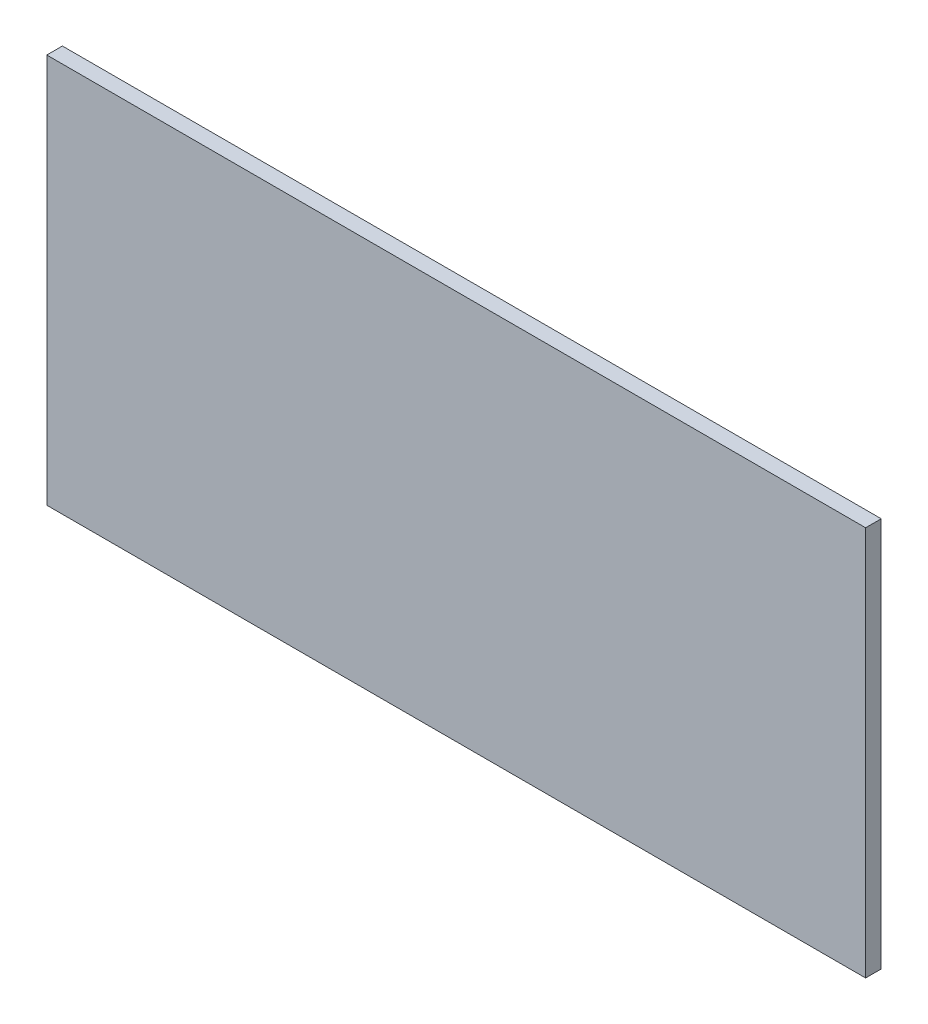
ISO-10303-21;
HEADER;
FILE_DESCRIPTION(('STEP AP214'),'2;1');
FILE_NAME('part.step','',(''),(''),'','','');
FILE_SCHEMA(('AUTOMOTIVE_DESIGN { 1 0 10303 214 1 1 1 1 }'));
ENDSEC;
DATA;
#1=APPLICATION_CONTEXT('core data for automotive mechanical design processes');
#2=APPLICATION_PROTOCOL_DEFINITION('international standard','automotive_design',2000,#1);
#3=PRODUCT_CONTEXT('',#1,'mechanical');
#4=PRODUCT('Part','Part','',(#3));
#5=PRODUCT_RELATED_PRODUCT_CATEGORY('part','',(#4));
#6=PRODUCT_DEFINITION_FORMATION('','',#4);
#7=PRODUCT_DEFINITION_CONTEXT('part definition',#1,'design');
#8=PRODUCT_DEFINITION('design','',#6,#7);
#9=PRODUCT_DEFINITION_SHAPE('','',#8);
#10=(LENGTH_UNIT() NAMED_UNIT(*) SI_UNIT(.MILLI.,.METRE.));
#11=(NAMED_UNIT(*) PLANE_ANGLE_UNIT() SI_UNIT($,.RADIAN.));
#12=(NAMED_UNIT(*) SI_UNIT($,.STERADIAN.) SOLID_ANGLE_UNIT());
#13=UNCERTAINTY_MEASURE_WITH_UNIT(LENGTH_MEASURE(1.E-05),#10,'distance_accuracy_value','');
#14=(GEOMETRIC_REPRESENTATION_CONTEXT(3) GLOBAL_UNCERTAINTY_ASSIGNED_CONTEXT((#13)) GLOBAL_UNIT_ASSIGNED_CONTEXT((#10,
#11,#12)) REPRESENTATION_CONTEXT('',''));
#15=CARTESIAN_POINT('',(0.,0.,0.));
#16=DIRECTION('',(0.,0.,1.));
#17=DIRECTION('',(1.,0.,0.));
#18=AXIS2_PLACEMENT_3D('',#15,#16,#17);
#19=CARTESIAN_POINT('',(20.,25.,2.));
#20=DIRECTION('',(0.,-1.,0.));
#21=DIRECTION('',(0.,0.,-1.));
#22=AXIS2_PLACEMENT_3D('',#19,#20,#21);
#23=PLANE('',#22);
#24=DIRECTION('',(-1.,0.,0.));
#25=VECTOR('',#24,1.);
#26=CARTESIAN_POINT('',(20.,25.,0.));
#27=LINE('',#26,#25);
#28=CARTESIAN_POINT('',(125.,25.,0.));
#29=VERTEX_POINT('',#28);
#30=CARTESIAN_POINT('',(20.,25.,0.));
#31=VERTEX_POINT('',#30);
#32=EDGE_CURVE('E111',#29,#31,#27,.T.);
#33=ORIENTED_EDGE('',*,*,#32,.T.);
#34=DIRECTION('',(0.,0.,-1.));
#35=VECTOR('',#34,1.);
#36=CARTESIAN_POINT('',(20.,25.,2.));
#37=LINE('',#36,#35);
#38=CARTESIAN_POINT('',(20.,25.,2.));
#39=VERTEX_POINT('',#38);
#40=EDGE_CURVE('E11',#39,#31,#37,.T.);
#41=ORIENTED_EDGE('',*,*,#40,.F.);
#42=DIRECTION('',(-1.,0.,0.));
#43=VECTOR('',#42,1.);
#44=CARTESIAN_POINT('',(20.,25.,2.));
#45=LINE('',#44,#43);
#46=CARTESIAN_POINT('',(125.,25.,2.));
#47=VERTEX_POINT('',#46);
#48=EDGE_CURVE('E95',#47,#39,#45,.T.);
#49=ORIENTED_EDGE('',*,*,#48,.F.);
#50=DIRECTION('',(0.,0.,-1.));
#51=VECTOR('',#50,1.);
#52=CARTESIAN_POINT('',(125.,25.,2.));
#53=LINE('',#52,#51);
#54=EDGE_CURVE('E107',#47,#29,#53,.T.);
#55=ORIENTED_EDGE('',*,*,#54,.T.);
#56=EDGE_LOOP('',(#33,#41,#49,#55));
#57=FACE_BOUND('',#56,.T.);
#58=ADVANCED_FACE('F43',(#57),#23,.F.);
#59=CARTESIAN_POINT('',(20.,25.,2.));
#60=DIRECTION('',(1.,0.,0.));
#61=DIRECTION('',(0.,1.,0.));
#62=AXIS2_PLACEMENT_3D('',#59,#60,#61);
#63=PLANE('',#62);
#64=DIRECTION('',(0.,-1.,0.));
#65=VECTOR('',#64,1.);
#66=CARTESIAN_POINT('',(20.,25.,0.));
#67=LINE('',#66,#65);
#68=CARTESIAN_POINT('',(20.,-25.,0.));
#69=VERTEX_POINT('',#68);
#70=EDGE_CURVE('E100',#31,#69,#67,.T.);
#71=ORIENTED_EDGE('',*,*,#70,.T.);
#72=DIRECTION('',(0.,0.,-1.));
#73=VECTOR('',#72,1.);
#74=CARTESIAN_POINT('',(20.,-25.,2.));
#75=LINE('',#74,#73);
#76=CARTESIAN_POINT('',(20.,-25.,2.));
#77=VERTEX_POINT('',#76);
#78=EDGE_CURVE('E52',#77,#69,#75,.T.);
#79=ORIENTED_EDGE('',*,*,#78,.F.);
#80=DIRECTION('',(0.,-1.,0.));
#81=VECTOR('',#80,1.);
#82=CARTESIAN_POINT('',(20.,25.,2.));
#83=LINE('',#82,#81);
#84=EDGE_CURVE('E90',#39,#77,#83,.T.);
#85=ORIENTED_EDGE('',*,*,#84,.F.);
#86=ORIENTED_EDGE('',*,*,#40,.T.);
#87=EDGE_LOOP('',(#71,#79,#85,#86));
#88=FACE_BOUND('',#87,.T.);
#89=ADVANCED_FACE('F99',(#88),#63,.F.);
#90=CARTESIAN_POINT('',(20.,-25.,2.));
#91=DIRECTION('',(0.,1.,0.));
#92=DIRECTION('',(-1.,0.,0.));
#93=AXIS2_PLACEMENT_3D('',#90,#91,#92);
#94=PLANE('',#93);
#95=DIRECTION('',(1.,0.,0.));
#96=VECTOR('',#95,1.);
#97=CARTESIAN_POINT('',(20.,-25.,0.));
#98=LINE('',#97,#96);
#99=CARTESIAN_POINT('',(125.,-25.,0.));
#100=VERTEX_POINT('',#99);
#101=EDGE_CURVE('E77',#69,#100,#98,.T.);
#102=ORIENTED_EDGE('',*,*,#101,.T.);
#103=DIRECTION('',(0.,0.,-1.));
#104=VECTOR('',#103,1.);
#105=CARTESIAN_POINT('',(125.,-25.,2.));
#106=LINE('',#105,#104);
#107=CARTESIAN_POINT('',(125.,-25.,2.));
#108=VERTEX_POINT('',#107);
#109=EDGE_CURVE('E102',#108,#100,#106,.T.);
#110=ORIENTED_EDGE('',*,*,#109,.F.);
#111=DIRECTION('',(1.,0.,0.));
#112=VECTOR('',#111,1.);
#113=CARTESIAN_POINT('',(20.,-25.,2.));
#114=LINE('',#113,#112);
#115=EDGE_CURVE('E93',#77,#108,#114,.T.);
#116=ORIENTED_EDGE('',*,*,#115,.F.);
#117=ORIENTED_EDGE('',*,*,#78,.T.);
#118=EDGE_LOOP('',(#102,#110,#116,#117));
#119=FACE_BOUND('',#118,.T.);
#120=ADVANCED_FACE('F103',(#119),#94,.F.);
#121=CARTESIAN_POINT('',(125.,25.,2.));
#122=DIRECTION('',(-1.,0.,0.));
#123=DIRECTION('',(0.,0.,1.));
#124=AXIS2_PLACEMENT_3D('',#121,#122,#123);
#125=PLANE('',#124);
#126=DIRECTION('',(0.,1.,0.));
#127=VECTOR('',#126,1.);
#128=CARTESIAN_POINT('',(125.,25.,0.));
#129=LINE('',#128,#127);
#130=EDGE_CURVE('E83',#100,#29,#129,.T.);
#131=ORIENTED_EDGE('',*,*,#130,.T.);
#132=ORIENTED_EDGE('',*,*,#54,.F.);
#133=DIRECTION('',(0.,1.,0.));
#134=VECTOR('',#133,1.);
#135=CARTESIAN_POINT('',(125.,25.,2.));
#136=LINE('',#135,#134);
#137=EDGE_CURVE('E60',#108,#47,#136,.T.);
#138=ORIENTED_EDGE('',*,*,#137,.F.);
#139=ORIENTED_EDGE('',*,*,#109,.T.);
#140=EDGE_LOOP('',(#131,#132,#138,#139));
#141=FACE_BOUND('',#140,.T.);
#142=ADVANCED_FACE('F124',(#141),#125,.F.);
#143=CARTESIAN_POINT('',(0.,0.,2.));
#144=DIRECTION('',(0.,0.,-1.));
#145=DIRECTION('',(-1.,0.,0.));
#146=AXIS2_PLACEMENT_3D('',#143,#144,#145);
#147=PLANE('',#146);
#148=ORIENTED_EDGE('',*,*,#48,.T.);
#149=ORIENTED_EDGE('',*,*,#84,.T.);
#150=ORIENTED_EDGE('',*,*,#115,.T.);
#151=ORIENTED_EDGE('',*,*,#137,.T.);
#152=EDGE_LOOP('',(#148,#149,#150,#151));
#153=FACE_BOUND('',#152,.T.);
#154=ADVANCED_FACE('F91',(#153),#147,.F.);
#155=CARTESIAN_POINT('',(0.,0.,0.));
#156=DIRECTION('',(0.,0.,-1.));
#157=DIRECTION('',(-1.,0.,0.));
#158=AXIS2_PLACEMENT_3D('',#155,#156,#157);
#159=PLANE('',#158);
#160=ORIENTED_EDGE('',*,*,#32,.F.);
#161=ORIENTED_EDGE('',*,*,#130,.F.);
#162=ORIENTED_EDGE('',*,*,#101,.F.);
#163=ORIENTED_EDGE('',*,*,#70,.F.);
#164=EDGE_LOOP('',(#160,#161,#162,#163));
#165=FACE_BOUND('',#164,.T.);
#166=ADVANCED_FACE('F127',(#165),#159,.T.);
#167=CLOSED_SHELL('',(#58,#89,#120,#142,#154,#166));
#168=MANIFOLD_SOLID_BREP('B2',#167);
#169=ADVANCED_BREP_SHAPE_REPRESENTATION('',(#18,#168),#14);
#170=SHAPE_DEFINITION_REPRESENTATION(#9,#169);
ENDSEC;
END-ISO-10303-21;
